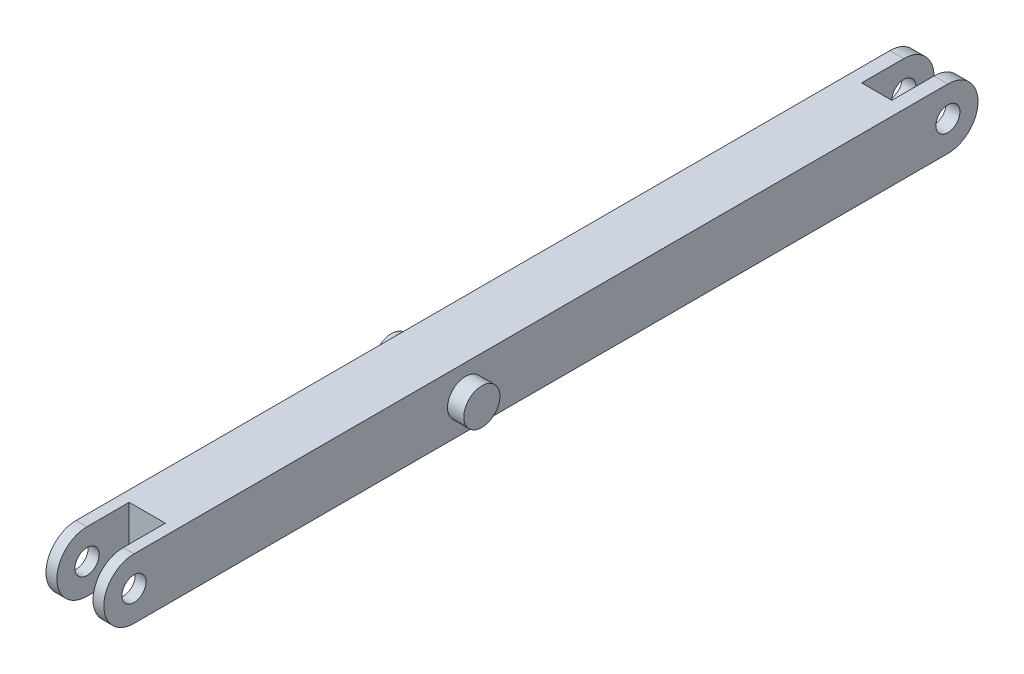
ISO-10303-21;
HEADER;
FILE_DESCRIPTION(('STEP AP214'),'2;1');
FILE_NAME('part.step','',(''),(''),'','','');
FILE_SCHEMA(('AUTOMOTIVE_DESIGN { 1 0 10303 214 1 1 1 1 }'));
ENDSEC;
DATA;
#1=APPLICATION_CONTEXT('core data for automotive mechanical design processes');
#2=APPLICATION_PROTOCOL_DEFINITION('international standard','automotive_design',2000,#1);
#3=PRODUCT_CONTEXT('',#1,'mechanical');
#4=PRODUCT('Part','Part','',(#3));
#5=PRODUCT_RELATED_PRODUCT_CATEGORY('part','',(#4));
#6=PRODUCT_DEFINITION_FORMATION('','',#4);
#7=PRODUCT_DEFINITION_CONTEXT('part definition',#1,'design');
#8=PRODUCT_DEFINITION('design','',#6,#7);
#9=PRODUCT_DEFINITION_SHAPE('','',#8);
#10=(LENGTH_UNIT() NAMED_UNIT(*) SI_UNIT(.MILLI.,.METRE.));
#11=(NAMED_UNIT(*) PLANE_ANGLE_UNIT() SI_UNIT($,.RADIAN.));
#12=(NAMED_UNIT(*) SI_UNIT($,.STERADIAN.) SOLID_ANGLE_UNIT());
#13=UNCERTAINTY_MEASURE_WITH_UNIT(LENGTH_MEASURE(1.E-05),#10,'distance_accuracy_value','');
#14=(GEOMETRIC_REPRESENTATION_CONTEXT(3) GLOBAL_UNCERTAINTY_ASSIGNED_CONTEXT((#13)) GLOBAL_UNIT_ASSIGNED_CONTEXT((#10,
#11,#12)) REPRESENTATION_CONTEXT('',''));
#15=CARTESIAN_POINT('',(0.,0.,0.));
#16=DIRECTION('',(0.,0.,1.));
#17=DIRECTION('',(1.,0.,0.));
#18=AXIS2_PLACEMENT_3D('',#15,#16,#17);
#19=CARTESIAN_POINT('',(24.,0.,275.));
#20=DIRECTION('',(-1.,0.,0.));
#21=DIRECTION('',(0.,0.,1.));
#22=AXIS2_PLACEMENT_3D('',#19,#20,#21);
#23=CYLINDRICAL_SURFACE('',#22,25.);
#24=CARTESIAN_POINT('',(-15.,0.,275.));
#25=DIRECTION('',(-1.,0.,0.));
#26=DIRECTION('',(0.,0.,1.));
#27=AXIS2_PLACEMENT_3D('',#24,#25,#26);
#28=CIRCLE('',#27,25.);
#29=CARTESIAN_POINT('',(-15.,-25.,275.));
#30=VERTEX_POINT('',#29);
#31=CARTESIAN_POINT('',(-15.,25.,275.));
#32=VERTEX_POINT('',#31);
#33=EDGE_CURVE('E160',#30,#32,#28,.T.);
#34=ORIENTED_EDGE('',*,*,#33,.T.);
#35=DIRECTION('',(-1.,0.,0.));
#36=VECTOR('',#35,1.);
#37=CARTESIAN_POINT('',(24.,25.,275.));
#38=LINE('',#37,#36);
#39=CARTESIAN_POINT('',(-24.,25.,275.));
#40=VERTEX_POINT('',#39);
#41=EDGE_CURVE('E210',#32,#40,#38,.T.);
#42=ORIENTED_EDGE('',*,*,#41,.T.);
#43=CARTESIAN_POINT('',(-24.,0.,275.));
#44=DIRECTION('',(1.,0.,0.));
#45=DIRECTION('',(0.,0.,-1.));
#46=AXIS2_PLACEMENT_3D('',#43,#44,#45);
#47=CIRCLE('',#46,25.);
#48=CARTESIAN_POINT('',(-24.,-25.,275.));
#49=VERTEX_POINT('',#48);
#50=EDGE_CURVE('E197',#40,#49,#47,.T.);
#51=ORIENTED_EDGE('',*,*,#50,.T.);
#52=DIRECTION('',(-1.,0.,0.));
#53=VECTOR('',#52,1.);
#54=CARTESIAN_POINT('',(24.,-25.,275.));
#55=LINE('',#54,#53);
#56=EDGE_CURVE('E232',#30,#49,#55,.T.);
#57=ORIENTED_EDGE('',*,*,#56,.F.);
#58=EDGE_LOOP('',(#34,#42,#51,#57));
#59=FACE_BOUND('',#58,.T.);
#60=ADVANCED_FACE('F35',(#59),#23,.T.);
#61=CARTESIAN_POINT('',(24.,0.,275.));
#62=DIRECTION('',(-1.,0.,0.));
#63=DIRECTION('',(0.,0.,1.));
#64=AXIS2_PLACEMENT_3D('',#61,#62,#63);
#65=CYLINDRICAL_SURFACE('',#64,9.99999999999998);
#66=CARTESIAN_POINT('',(-15.,0.,275.));
#67=DIRECTION('',(-1.,0.,0.));
#68=DIRECTION('',(0.,0.,1.));
#69=AXIS2_PLACEMENT_3D('',#66,#67,#68);
#70=CIRCLE('',#69,9.99999999999998);
#71=CARTESIAN_POINT('',(-15.,0.,285.));
#72=VERTEX_POINT('',#71);
#73=EDGE_CURVE('E159',#72,#72,#70,.T.);
#74=ORIENTED_EDGE('',*,*,#73,.F.);
#75=EDGE_LOOP('',(#74));
#76=FACE_BOUND('',#75,.T.);
#77=CARTESIAN_POINT('',(-24.,0.,275.));
#78=DIRECTION('',(1.,0.,0.));
#79=DIRECTION('',(0.,0.,-1.));
#80=AXIS2_PLACEMENT_3D('',#77,#78,#79);
#81=CIRCLE('',#80,9.99999999999998);
#82=CARTESIAN_POINT('',(-24.,0.,265.));
#83=VERTEX_POINT('',#82);
#84=EDGE_CURVE('E187',#83,#83,#81,.T.);
#85=ORIENTED_EDGE('',*,*,#84,.F.);
#86=EDGE_LOOP('',(#85));
#87=FACE_BOUND('',#86,.T.);
#88=ADVANCED_FACE('F245',(#76,#87),#65,.F.);
#89=CARTESIAN_POINT('',(24.,0.,-400.));
#90=DIRECTION('',(-1.,0.,0.));
#91=DIRECTION('',(0.,0.,1.));
#92=AXIS2_PLACEMENT_3D('',#89,#90,#91);
#93=CYLINDRICAL_SURFACE('',#92,25.);
#94=DIRECTION('',(-1.,0.,0.));
#95=VECTOR('',#94,1.);
#96=CARTESIAN_POINT('',(24.,25.,-400.));
#97=LINE('',#96,#95);
#98=CARTESIAN_POINT('',(-12.5,25.,-400.));
#99=VERTEX_POINT('',#98);
#100=CARTESIAN_POINT('',(-24.,25.,-400.));
#101=VERTEX_POINT('',#100);
#102=EDGE_CURVE('E224',#99,#101,#97,.T.);
#103=ORIENTED_EDGE('',*,*,#102,.F.);
#104=CARTESIAN_POINT('',(-12.5,0.,-400.));
#105=DIRECTION('',(-1.,0.,0.));
#106=DIRECTION('',(0.,0.,1.));
#107=AXIS2_PLACEMENT_3D('',#104,#105,#106);
#108=CIRCLE('',#107,25.);
#109=CARTESIAN_POINT('',(-12.5,-25.,-400.));
#110=VERTEX_POINT('',#109);
#111=EDGE_CURVE('E185',#99,#110,#108,.T.);
#112=ORIENTED_EDGE('',*,*,#111,.T.);
#113=DIRECTION('',(-1.,0.,0.));
#114=VECTOR('',#113,1.);
#115=CARTESIAN_POINT('',(24.,-25.,-400.));
#116=LINE('',#115,#114);
#117=CARTESIAN_POINT('',(-24.,-25.,-400.));
#118=VERTEX_POINT('',#117);
#119=EDGE_CURVE('E228',#110,#118,#116,.T.);
#120=ORIENTED_EDGE('',*,*,#119,.T.);
#121=CARTESIAN_POINT('',(-24.,0.,-400.));
#122=DIRECTION('',(1.,0.,0.));
#123=DIRECTION('',(0.,0.,-1.));
#124=AXIS2_PLACEMENT_3D('',#121,#122,#123);
#125=CIRCLE('',#124,25.);
#126=EDGE_CURVE('E216',#118,#101,#125,.T.);
#127=ORIENTED_EDGE('',*,*,#126,.T.);
#128=EDGE_LOOP('',(#103,#112,#120,#127));
#129=FACE_BOUND('',#128,.T.);
#130=ADVANCED_FACE('F248',(#129),#93,.T.);
#131=CARTESIAN_POINT('',(24.,0.,-400.));
#132=DIRECTION('',(-1.,0.,0.));
#133=DIRECTION('',(0.,0.,1.));
#134=AXIS2_PLACEMENT_3D('',#131,#132,#133);
#135=CYLINDRICAL_SURFACE('',#134,9.99999999999998);
#136=CARTESIAN_POINT('',(-12.5,0.,-400.));
#137=DIRECTION('',(-1.,0.,0.));
#138=DIRECTION('',(0.,0.,1.));
#139=AXIS2_PLACEMENT_3D('',#136,#137,#138);
#140=CIRCLE('',#139,9.99999999999998);
#141=CARTESIAN_POINT('',(-12.5,0.,-390.));
#142=VERTEX_POINT('',#141);
#143=EDGE_CURVE('E184',#142,#142,#140,.T.);
#144=ORIENTED_EDGE('',*,*,#143,.F.);
#145=EDGE_LOOP('',(#144));
#146=FACE_BOUND('',#145,.T.);
#147=CARTESIAN_POINT('',(-24.,0.,-400.));
#148=DIRECTION('',(1.,0.,0.));
#149=DIRECTION('',(0.,0.,-1.));
#150=AXIS2_PLACEMENT_3D('',#147,#148,#149);
#151=CIRCLE('',#150,9.99999999999998);
#152=CARTESIAN_POINT('',(-24.,0.,-410.));
#153=VERTEX_POINT('',#152);
#154=EDGE_CURVE('E191',#153,#153,#151,.T.);
#155=ORIENTED_EDGE('',*,*,#154,.F.);
#156=EDGE_LOOP('',(#155));
#157=FACE_BOUND('',#156,.T.);
#158=ADVANCED_FACE('F263',(#146,#157),#135,.F.);
#159=CARTESIAN_POINT('',(24.,0.,275.));
#160=DIRECTION('',(1.,0.,0.));
#161=DIRECTION('',(0.,0.,-1.));
#162=AXIS2_PLACEMENT_3D('',#159,#160,#161);
#163=PLANE('',#162);
#164=CARTESIAN_POINT('',(24.,0.,0.));
#165=DIRECTION('',(1.,0.,0.));
#166=DIRECTION('',(0.,0.,-1.));
#167=AXIS2_PLACEMENT_3D('',#164,#165,#166);
#168=CIRCLE('',#167,15.);
#169=CARTESIAN_POINT('',(24.,0.,-15.));
#170=VERTEX_POINT('',#169);
#171=EDGE_CURVE('E153',#170,#170,#168,.F.);
#172=ORIENTED_EDGE('',*,*,#171,.T.);
#173=EDGE_LOOP('',(#172));
#174=FACE_BOUND('',#173,.T.);
#175=CARTESIAN_POINT('',(24.,0.,-400.));
#176=DIRECTION('',(1.,0.,0.));
#177=DIRECTION('',(0.,0.,-1.));
#178=AXIS2_PLACEMENT_3D('',#175,#176,#177);
#179=CIRCLE('',#178,9.99999999999998);
#180=CARTESIAN_POINT('',(24.,0.,-410.));
#181=VERTEX_POINT('',#180);
#182=EDGE_CURVE('E194',#181,#181,#179,.T.);
#183=ORIENTED_EDGE('',*,*,#182,.F.);
#184=EDGE_LOOP('',(#183));
#185=FACE_BOUND('',#184,.T.);
#186=CARTESIAN_POINT('',(24.,0.,275.));
#187=DIRECTION('',(1.,0.,0.));
#188=DIRECTION('',(0.,0.,-1.));
#189=AXIS2_PLACEMENT_3D('',#186,#187,#188);
#190=CIRCLE('',#189,25.);
#191=CARTESIAN_POINT('',(24.,25.,275.));
#192=VERTEX_POINT('',#191);
#193=CARTESIAN_POINT('',(24.,-25.,275.));
#194=VERTEX_POINT('',#193);
#195=EDGE_CURVE('E200',#192,#194,#190,.T.);
#196=ORIENTED_EDGE('',*,*,#195,.T.);
#197=DIRECTION('',(0.,0.,-1.));
#198=VECTOR('',#197,1.);
#199=CARTESIAN_POINT('',(24.,-25.,275.));
#200=LINE('',#199,#198);
#201=CARTESIAN_POINT('',(24.,-25.,-400.));
#202=VERTEX_POINT('',#201);
#203=EDGE_CURVE('E203',#194,#202,#200,.T.);
#204=ORIENTED_EDGE('',*,*,#203,.T.);
#205=CARTESIAN_POINT('',(24.,0.,-400.));
#206=DIRECTION('',(1.,0.,0.));
#207=DIRECTION('',(0.,0.,-1.));
#208=AXIS2_PLACEMENT_3D('',#205,#206,#207);
#209=CIRCLE('',#208,25.);
#210=CARTESIAN_POINT('',(24.,25.,-400.));
#211=VERTEX_POINT('',#210);
#212=EDGE_CURVE('E206',#202,#211,#209,.T.);
#213=ORIENTED_EDGE('',*,*,#212,.T.);
#214=DIRECTION('',(0.,0.,1.));
#215=VECTOR('',#214,1.);
#216=CARTESIAN_POINT('',(24.,25.,275.));
#217=LINE('',#216,#215);
#218=EDGE_CURVE('E208',#211,#192,#217,.T.);
#219=ORIENTED_EDGE('',*,*,#218,.T.);
#220=EDGE_LOOP('',(#196,#204,#213,#219));
#221=FACE_BOUND('',#220,.T.);
#222=CARTESIAN_POINT('',(24.,0.,275.));
#223=DIRECTION('',(1.,0.,0.));
#224=DIRECTION('',(0.,0.,-1.));
#225=AXIS2_PLACEMENT_3D('',#222,#223,#224);
#226=CIRCLE('',#225,9.99999999999998);
#227=CARTESIAN_POINT('',(24.,0.,265.));
#228=VERTEX_POINT('',#227);
#229=EDGE_CURVE('E188',#228,#228,#226,.T.);
#230=ORIENTED_EDGE('',*,*,#229,.F.);
#231=EDGE_LOOP('',(#230));
#232=FACE_BOUND('',#231,.T.);
#233=ADVANCED_FACE('F255',(#174,#185,#221,#232),#163,.T.);
#234=CARTESIAN_POINT('',(-24.,0.,275.));
#235=DIRECTION('',(1.,0.,0.));
#236=DIRECTION('',(0.,0.,-1.));
#237=AXIS2_PLACEMENT_3D('',#234,#235,#236);
#238=PLANE('',#237);
#239=CARTESIAN_POINT('',(-24.,0.,0.));
#240=DIRECTION('',(1.,0.,0.));
#241=DIRECTION('',(0.,0.,-1.));
#242=AXIS2_PLACEMENT_3D('',#239,#240,#241);
#243=CIRCLE('',#242,15.);
#244=CARTESIAN_POINT('',(-24.,0.,-15.));
#245=VERTEX_POINT('',#244);
#246=EDGE_CURVE('E11',#245,#245,#243,.F.);
#247=ORIENTED_EDGE('',*,*,#246,.F.);
#248=EDGE_LOOP('',(#247));
#249=FACE_BOUND('',#248,.T.);
#250=ORIENTED_EDGE('',*,*,#50,.F.);
#251=DIRECTION('',(0.,0.,1.));
#252=VECTOR('',#251,1.);
#253=CARTESIAN_POINT('',(-24.,25.,275.));
#254=LINE('',#253,#252);
#255=EDGE_CURVE('E204',#101,#40,#254,.T.);
#256=ORIENTED_EDGE('',*,*,#255,.F.);
#257=ORIENTED_EDGE('',*,*,#126,.F.);
#258=DIRECTION('',(0.,0.,-1.));
#259=VECTOR('',#258,1.);
#260=CARTESIAN_POINT('',(-24.,-25.,275.));
#261=LINE('',#260,#259);
#262=EDGE_CURVE('E213',#49,#118,#261,.T.);
#263=ORIENTED_EDGE('',*,*,#262,.F.);
#264=EDGE_LOOP('',(#250,#256,#257,#263));
#265=FACE_BOUND('',#264,.T.);
#266=ORIENTED_EDGE('',*,*,#154,.T.);
#267=EDGE_LOOP('',(#266));
#268=FACE_BOUND('',#267,.T.);
#269=ORIENTED_EDGE('',*,*,#84,.T.);
#270=EDGE_LOOP('',(#269));
#271=FACE_BOUND('',#270,.T.);
#272=ADVANCED_FACE('F253',(#249,#265,#268,#271),#238,.F.);
#273=CARTESIAN_POINT('',(15.,25.,275.));
#274=VERTEX_POINT('',#273);
#275=EDGE_CURVE('E221',#192,#274,#38,.T.);
#276=ORIENTED_EDGE('',*,*,#275,.T.);
#277=CARTESIAN_POINT('',(15.,0.,275.));
#278=DIRECTION('',(1.,0.,0.));
#279=DIRECTION('',(0.,0.,-1.));
#280=AXIS2_PLACEMENT_3D('',#277,#278,#279);
#281=CIRCLE('',#280,25.);
#282=CARTESIAN_POINT('',(15.,-25.,275.));
#283=VERTEX_POINT('',#282);
#284=EDGE_CURVE('E50',#274,#283,#281,.T.);
#285=ORIENTED_EDGE('',*,*,#284,.T.);
#286=EDGE_CURVE('E43',#194,#283,#55,.T.);
#287=ORIENTED_EDGE('',*,*,#286,.F.);
#288=ORIENTED_EDGE('',*,*,#195,.F.);
#289=EDGE_LOOP('',(#276,#285,#287,#288));
#290=FACE_BOUND('',#289,.T.);
#291=ADVANCED_FACE('F37',(#290),#23,.T.);
#292=CARTESIAN_POINT('',(24.,-25.,275.));
#293=DIRECTION('',(0.,1.,0.));
#294=DIRECTION('',(0.,0.,1.));
#295=AXIS2_PLACEMENT_3D('',#292,#293,#294);
#296=PLANE('',#295);
#297=DIRECTION('',(-1.,0.,0.));
#298=VECTOR('',#297,1.);
#299=CARTESIAN_POINT('',(-15.,-25.,240.));
#300=LINE('',#299,#298);
#301=CARTESIAN_POINT('',(15.,-25.,240.));
#302=VERTEX_POINT('',#301);
#303=CARTESIAN_POINT('',(-15.,-25.,240.));
#304=VERTEX_POINT('',#303);
#305=EDGE_CURVE('E134',#302,#304,#300,.T.);
#306=ORIENTED_EDGE('',*,*,#305,.T.);
#307=DIRECTION('',(0.,0.,1.));
#308=VECTOR('',#307,1.);
#309=CARTESIAN_POINT('',(-15.,-25.,300.));
#310=LINE('',#309,#308);
#311=EDGE_CURVE('E144',#304,#30,#310,.T.);
#312=ORIENTED_EDGE('',*,*,#311,.T.);
#313=ORIENTED_EDGE('',*,*,#56,.T.);
#314=ORIENTED_EDGE('',*,*,#262,.T.);
#315=ORIENTED_EDGE('',*,*,#119,.F.);
#316=DIRECTION('',(0.,0.,1.));
#317=VECTOR('',#316,1.);
#318=CARTESIAN_POINT('',(-12.5,-25.,-425.));
#319=LINE('',#318,#317);
#320=CARTESIAN_POINT('',(-12.5,-25.,-365.));
#321=VERTEX_POINT('',#320);
#322=EDGE_CURVE('E163',#110,#321,#319,.T.);
#323=ORIENTED_EDGE('',*,*,#322,.T.);
#324=DIRECTION('',(1.,0.,0.));
#325=VECTOR('',#324,1.);
#326=CARTESIAN_POINT('',(-12.5,-25.,-365.));
#327=LINE('',#326,#325);
#328=CARTESIAN_POINT('',(12.5,-25.,-365.));
#329=VERTEX_POINT('',#328);
#330=EDGE_CURVE('E166',#321,#329,#327,.T.);
#331=ORIENTED_EDGE('',*,*,#330,.T.);
#332=DIRECTION('',(0.,0.,-1.));
#333=VECTOR('',#332,1.);
#334=CARTESIAN_POINT('',(12.5,-25.,-425.));
#335=LINE('',#334,#333);
#336=CARTESIAN_POINT('',(12.5,-25.,-400.));
#337=VERTEX_POINT('',#336);
#338=EDGE_CURVE('E170',#329,#337,#335,.T.);
#339=ORIENTED_EDGE('',*,*,#338,.T.);
#340=EDGE_CURVE('E229',#202,#337,#116,.T.);
#341=ORIENTED_EDGE('',*,*,#340,.F.);
#342=ORIENTED_EDGE('',*,*,#203,.F.);
#343=ORIENTED_EDGE('',*,*,#286,.T.);
#344=DIRECTION('',(0.,0.,-1.));
#345=VECTOR('',#344,1.);
#346=CARTESIAN_POINT('',(15.,-25.,300.));
#347=LINE('',#346,#345);
#348=EDGE_CURVE('E127',#283,#302,#347,.T.);
#349=ORIENTED_EDGE('',*,*,#348,.T.);
#350=EDGE_LOOP('',(#306,#312,#313,#314,#315,#323,#331,#339,#341,#342,#343,#349));
#351=FACE_BOUND('',#350,.T.);
#352=ADVANCED_FACE('F142',(#351),#296,.F.);
#353=CARTESIAN_POINT('',(12.5,0.,-400.));
#354=DIRECTION('',(1.,0.,0.));
#355=DIRECTION('',(0.,0.,-1.));
#356=AXIS2_PLACEMENT_3D('',#353,#354,#355);
#357=CIRCLE('',#356,25.);
#358=CARTESIAN_POINT('',(12.5,25.,-400.));
#359=VERTEX_POINT('',#358);
#360=EDGE_CURVE('E182',#337,#359,#357,.T.);
#361=ORIENTED_EDGE('',*,*,#360,.T.);
#362=EDGE_CURVE('E225',#211,#359,#97,.T.);
#363=ORIENTED_EDGE('',*,*,#362,.F.);
#364=ORIENTED_EDGE('',*,*,#212,.F.);
#365=ORIENTED_EDGE('',*,*,#340,.T.);
#366=EDGE_LOOP('',(#361,#363,#364,#365));
#367=FACE_BOUND('',#366,.T.);
#368=ADVANCED_FACE('F297',(#367),#93,.T.);
#369=CARTESIAN_POINT('',(24.,25.,275.));
#370=DIRECTION('',(0.,-1.,0.));
#371=DIRECTION('',(0.,0.,-1.));
#372=AXIS2_PLACEMENT_3D('',#369,#370,#371);
#373=PLANE('',#372);
#374=ORIENTED_EDGE('',*,*,#41,.F.);
#375=DIRECTION('',(0.,0.,1.));
#376=VECTOR('',#375,1.);
#377=CARTESIAN_POINT('',(-15.,25.,300.));
#378=LINE('',#377,#376);
#379=CARTESIAN_POINT('',(-15.,25.,240.));
#380=VERTEX_POINT('',#379);
#381=EDGE_CURVE('E150',#380,#32,#378,.T.);
#382=ORIENTED_EDGE('',*,*,#381,.F.);
#383=DIRECTION('',(-1.,0.,0.));
#384=VECTOR('',#383,1.);
#385=CARTESIAN_POINT('',(-15.,25.,240.));
#386=LINE('',#385,#384);
#387=CARTESIAN_POINT('',(15.,25.,240.));
#388=VERTEX_POINT('',#387);
#389=EDGE_CURVE('E146',#388,#380,#386,.T.);
#390=ORIENTED_EDGE('',*,*,#389,.F.);
#391=DIRECTION('',(0.,0.,-1.));
#392=VECTOR('',#391,1.);
#393=CARTESIAN_POINT('',(15.,25.,300.));
#394=LINE('',#393,#392);
#395=EDGE_CURVE('E129',#274,#388,#394,.T.);
#396=ORIENTED_EDGE('',*,*,#395,.F.);
#397=ORIENTED_EDGE('',*,*,#275,.F.);
#398=ORIENTED_EDGE('',*,*,#218,.F.);
#399=ORIENTED_EDGE('',*,*,#362,.T.);
#400=DIRECTION('',(0.,0.,-1.));
#401=VECTOR('',#400,1.);
#402=CARTESIAN_POINT('',(12.5,25.,-425.));
#403=LINE('',#402,#401);
#404=CARTESIAN_POINT('',(12.5,25.,-365.));
#405=VERTEX_POINT('',#404);
#406=EDGE_CURVE('E167',#405,#359,#403,.T.);
#407=ORIENTED_EDGE('',*,*,#406,.F.);
#408=DIRECTION('',(1.,0.,0.));
#409=VECTOR('',#408,1.);
#410=CARTESIAN_POINT('',(-12.5,25.,-365.));
#411=LINE('',#410,#409);
#412=CARTESIAN_POINT('',(-12.5,25.,-365.));
#413=VERTEX_POINT('',#412);
#414=EDGE_CURVE('E174',#413,#405,#411,.T.);
#415=ORIENTED_EDGE('',*,*,#414,.F.);
#416=DIRECTION('',(0.,0.,1.));
#417=VECTOR('',#416,1.);
#418=CARTESIAN_POINT('',(-12.5,25.,-425.));
#419=LINE('',#418,#417);
#420=EDGE_CURVE('E162',#99,#413,#419,.T.);
#421=ORIENTED_EDGE('',*,*,#420,.F.);
#422=ORIENTED_EDGE('',*,*,#102,.T.);
#423=ORIENTED_EDGE('',*,*,#255,.T.);
#424=EDGE_LOOP('',(#374,#382,#390,#396,#397,#398,#399,#407,#415,#421,#422,#423));
#425=FACE_BOUND('',#424,.T.);
#426=ADVANCED_FACE('F277',(#425),#373,.F.);
#427=CARTESIAN_POINT('',(12.5,0.,-400.));
#428=DIRECTION('',(1.,0.,0.));
#429=DIRECTION('',(0.,0.,-1.));
#430=AXIS2_PLACEMENT_3D('',#427,#428,#429);
#431=CIRCLE('',#430,9.99999999999998);
#432=CARTESIAN_POINT('',(12.5,0.,-410.));
#433=VERTEX_POINT('',#432);
#434=EDGE_CURVE('E180',#433,#433,#431,.T.);
#435=ORIENTED_EDGE('',*,*,#434,.F.);
#436=EDGE_LOOP('',(#435));
#437=FACE_BOUND('',#436,.T.);
#438=ORIENTED_EDGE('',*,*,#182,.T.);
#439=EDGE_LOOP('',(#438));
#440=FACE_BOUND('',#439,.T.);
#441=ADVANCED_FACE('F320',(#437,#440),#135,.F.);
#442=CARTESIAN_POINT('',(15.,0.,275.));
#443=DIRECTION('',(1.,0.,0.));
#444=DIRECTION('',(0.,0.,-1.));
#445=AXIS2_PLACEMENT_3D('',#442,#443,#444);
#446=CIRCLE('',#445,9.99999999999998);
#447=CARTESIAN_POINT('',(15.,0.,265.));
#448=VERTEX_POINT('',#447);
#449=EDGE_CURVE('E156',#448,#448,#446,.T.);
#450=ORIENTED_EDGE('',*,*,#449,.F.);
#451=EDGE_LOOP('',(#450));
#452=FACE_BOUND('',#451,.T.);
#453=ORIENTED_EDGE('',*,*,#229,.T.);
#454=EDGE_LOOP('',(#453));
#455=FACE_BOUND('',#454,.T.);
#456=ADVANCED_FACE('F250',(#452,#455),#65,.F.);
#457=CARTESIAN_POINT('',(-12.5,-25.,-425.));
#458=DIRECTION('',(-1.,0.,0.));
#459=DIRECTION('',(0.,0.,1.));
#460=AXIS2_PLACEMENT_3D('',#457,#458,#459);
#461=PLANE('',#460);
#462=ORIENTED_EDGE('',*,*,#143,.T.);
#463=EDGE_LOOP('',(#462));
#464=FACE_BOUND('',#463,.T.);
#465=ORIENTED_EDGE('',*,*,#420,.T.);
#466=DIRECTION('',(0.,1.,0.));
#467=VECTOR('',#466,1.);
#468=CARTESIAN_POINT('',(-12.5,-25.,-365.));
#469=LINE('',#468,#467);
#470=EDGE_CURVE('E58',#321,#413,#469,.T.);
#471=ORIENTED_EDGE('',*,*,#470,.F.);
#472=ORIENTED_EDGE('',*,*,#322,.F.);
#473=ORIENTED_EDGE('',*,*,#111,.F.);
#474=EDGE_LOOP('',(#465,#471,#472,#473));
#475=FACE_BOUND('',#474,.T.);
#476=ADVANCED_FACE('F289',(#464,#475),#461,.F.);
#477=CARTESIAN_POINT('',(12.5,-25.,-425.));
#478=DIRECTION('',(1.,0.,0.));
#479=DIRECTION('',(0.,0.,-1.));
#480=AXIS2_PLACEMENT_3D('',#477,#478,#479);
#481=PLANE('',#480);
#482=ORIENTED_EDGE('',*,*,#434,.T.);
#483=EDGE_LOOP('',(#482));
#484=FACE_BOUND('',#483,.T.);
#485=ORIENTED_EDGE('',*,*,#360,.F.);
#486=ORIENTED_EDGE('',*,*,#338,.F.);
#487=DIRECTION('',(0.,1.,0.));
#488=VECTOR('',#487,1.);
#489=CARTESIAN_POINT('',(12.5,-25.,-365.));
#490=LINE('',#489,#488);
#491=EDGE_CURVE('E178',#329,#405,#490,.T.);
#492=ORIENTED_EDGE('',*,*,#491,.T.);
#493=ORIENTED_EDGE('',*,*,#406,.T.);
#494=EDGE_LOOP('',(#485,#486,#492,#493));
#495=FACE_BOUND('',#494,.T.);
#496=ADVANCED_FACE('F305',(#484,#495),#481,.F.);
#497=CARTESIAN_POINT('',(-12.5,-25.,-365.));
#498=DIRECTION('',(0.,0.,1.));
#499=DIRECTION('',(0.,-1.,0.));
#500=AXIS2_PLACEMENT_3D('',#497,#498,#499);
#501=PLANE('',#500);
#502=ORIENTED_EDGE('',*,*,#414,.T.);
#503=ORIENTED_EDGE('',*,*,#491,.F.);
#504=ORIENTED_EDGE('',*,*,#330,.F.);
#505=ORIENTED_EDGE('',*,*,#470,.T.);
#506=EDGE_LOOP('',(#502,#503,#504,#505));
#507=FACE_BOUND('',#506,.T.);
#508=ADVANCED_FACE('F291',(#507),#501,.F.);
#509=CARTESIAN_POINT('',(-15.,-25.,300.));
#510=DIRECTION('',(-1.,0.,0.));
#511=DIRECTION('',(0.,0.,1.));
#512=AXIS2_PLACEMENT_3D('',#509,#510,#511);
#513=PLANE('',#512);
#514=ORIENTED_EDGE('',*,*,#73,.T.);
#515=EDGE_LOOP('',(#514));
#516=FACE_BOUND('',#515,.T.);
#517=ORIENTED_EDGE('',*,*,#33,.F.);
#518=ORIENTED_EDGE('',*,*,#311,.F.);
#519=DIRECTION('',(0.,1.,0.));
#520=VECTOR('',#519,1.);
#521=CARTESIAN_POINT('',(-15.,-25.,240.));
#522=LINE('',#521,#520);
#523=EDGE_CURVE('E133',#304,#380,#522,.T.);
#524=ORIENTED_EDGE('',*,*,#523,.T.);
#525=ORIENTED_EDGE('',*,*,#381,.T.);
#526=EDGE_LOOP('',(#517,#518,#524,#525));
#527=FACE_BOUND('',#526,.T.);
#528=ADVANCED_FACE('F242',(#516,#527),#513,.F.);
#529=CARTESIAN_POINT('',(15.,-25.,300.));
#530=DIRECTION('',(1.,0.,0.));
#531=DIRECTION('',(0.,0.,-1.));
#532=AXIS2_PLACEMENT_3D('',#529,#530,#531);
#533=PLANE('',#532);
#534=ORIENTED_EDGE('',*,*,#449,.T.);
#535=EDGE_LOOP('',(#534));
#536=FACE_BOUND('',#535,.T.);
#537=ORIENTED_EDGE('',*,*,#395,.T.);
#538=DIRECTION('',(0.,1.,0.));
#539=VECTOR('',#538,1.);
#540=CARTESIAN_POINT('',(15.,-25.,240.));
#541=LINE('',#540,#539);
#542=EDGE_CURVE('E123',#302,#388,#541,.T.);
#543=ORIENTED_EDGE('',*,*,#542,.F.);
#544=ORIENTED_EDGE('',*,*,#348,.F.);
#545=ORIENTED_EDGE('',*,*,#284,.F.);
#546=EDGE_LOOP('',(#537,#543,#544,#545));
#547=FACE_BOUND('',#546,.T.);
#548=ADVANCED_FACE('F125',(#536,#547),#533,.F.);
#549=CARTESIAN_POINT('',(-15.,-25.,240.));
#550=DIRECTION('',(0.,0.,-1.));
#551=DIRECTION('',(0.,1.,0.));
#552=AXIS2_PLACEMENT_3D('',#549,#550,#551);
#553=PLANE('',#552);
#554=ORIENTED_EDGE('',*,*,#389,.T.);
#555=ORIENTED_EDGE('',*,*,#523,.F.);
#556=ORIENTED_EDGE('',*,*,#305,.F.);
#557=ORIENTED_EDGE('',*,*,#542,.T.);
#558=EDGE_LOOP('',(#554,#555,#556,#557));
#559=FACE_BOUND('',#558,.T.);
#560=ADVANCED_FACE('F137',(#559),#553,.F.);
#561=CARTESIAN_POINT('',(-37.5,0.,0.));
#562=DIRECTION('',(1.,0.,0.));
#563=DIRECTION('',(0.,0.,-1.));
#564=AXIS2_PLACEMENT_3D('',#561,#562,#563);
#565=PLANE('',#564);
#566=CARTESIAN_POINT('',(-37.5,0.,0.));
#567=DIRECTION('',(1.,0.,0.));
#568=DIRECTION('',(0.,0.,-1.));
#569=AXIS2_PLACEMENT_3D('',#566,#567,#568);
#570=CIRCLE('',#569,15.);
#571=CARTESIAN_POINT('',(-37.5,0.,-15.));
#572=VERTEX_POINT('',#571);
#573=EDGE_CURVE('E457',#572,#572,#570,.T.);
#574=ORIENTED_EDGE('',*,*,#573,.F.);
#575=EDGE_LOOP('',(#574));
#576=FACE_BOUND('',#575,.T.);
#577=ADVANCED_FACE('F408',(#576),#565,.F.);
#578=CARTESIAN_POINT('',(37.5,0.,0.));
#579=DIRECTION('',(-1.,0.,0.));
#580=DIRECTION('',(0.,0.,1.));
#581=AXIS2_PLACEMENT_3D('',#578,#579,#580);
#582=CYLINDRICAL_SURFACE('',#581,15.);
#583=ORIENTED_EDGE('',*,*,#573,.T.);
#584=EDGE_LOOP('',(#583));
#585=FACE_BOUND('',#584,.T.);
#586=ORIENTED_EDGE('',*,*,#246,.T.);
#587=EDGE_LOOP('',(#586));
#588=FACE_BOUND('',#587,.T.);
#589=ADVANCED_FACE('F417',(#585,#588),#582,.T.);
#590=ORIENTED_EDGE('',*,*,#171,.F.);
#591=EDGE_LOOP('',(#590));
#592=FACE_BOUND('',#591,.T.);
#593=CARTESIAN_POINT('',(37.5,0.,0.));
#594=DIRECTION('',(1.,0.,0.));
#595=DIRECTION('',(0.,0.,-1.));
#596=AXIS2_PLACEMENT_3D('',#593,#594,#595);
#597=CIRCLE('',#596,15.);
#598=CARTESIAN_POINT('',(37.5,0.,-15.));
#599=VERTEX_POINT('',#598);
#600=EDGE_CURVE('E455',#599,#599,#597,.T.);
#601=ORIENTED_EDGE('',*,*,#600,.F.);
#602=EDGE_LOOP('',(#601));
#603=FACE_BOUND('',#602,.T.);
#604=ADVANCED_FACE('F426',(#592,#603),#582,.T.);
#605=CARTESIAN_POINT('',(37.5,0.,0.));
#606=DIRECTION('',(1.,0.,0.));
#607=DIRECTION('',(0.,0.,-1.));
#608=AXIS2_PLACEMENT_3D('',#605,#606,#607);
#609=PLANE('',#608);
#610=ORIENTED_EDGE('',*,*,#600,.T.);
#611=EDGE_LOOP('',(#610));
#612=FACE_BOUND('',#611,.T.);
#613=ADVANCED_FACE('F435',(#612),#609,.T.);
#614=CLOSED_SHELL('',(#60,#88,#130,#158,#233,#272,#291,#352,#368,#426,#441,#456,#476,#496,#508,
#528,#548,#560,#577,#589,#604,#613));
#615=MANIFOLD_SOLID_BREP('B2',#614);
#616=ADVANCED_BREP_SHAPE_REPRESENTATION('',(#18,#615),#14);
#617=SHAPE_DEFINITION_REPRESENTATION(#9,#616);
ENDSEC;
END-ISO-10303-21;
